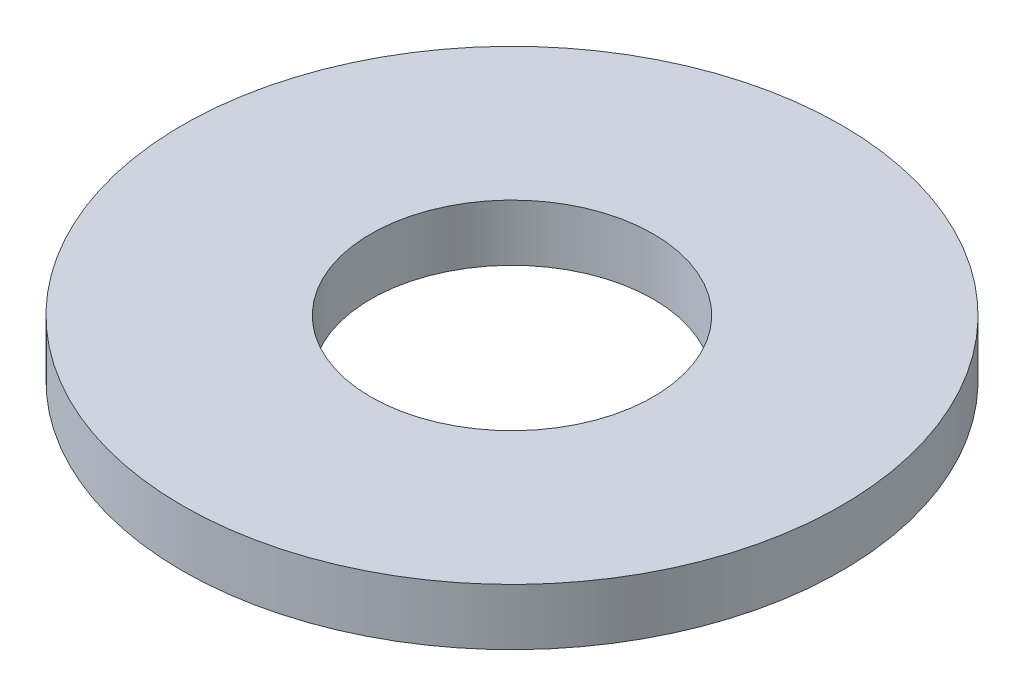
ISO-10303-21;
HEADER;
FILE_DESCRIPTION(('STEP AP214'),'2;1');
FILE_NAME('part.step','',(''),(''),'','','');
FILE_SCHEMA(('AUTOMOTIVE_DESIGN { 1 0 10303 214 1 1 1 1 }'));
ENDSEC;
DATA;
#1=APPLICATION_CONTEXT('core data for automotive mechanical design processes');
#2=APPLICATION_PROTOCOL_DEFINITION('international standard','automotive_design',2000,#1);
#3=PRODUCT_CONTEXT('',#1,'mechanical');
#4=PRODUCT('Part','Part','',(#3));
#5=PRODUCT_RELATED_PRODUCT_CATEGORY('part','',(#4));
#6=PRODUCT_DEFINITION_FORMATION('','',#4);
#7=PRODUCT_DEFINITION_CONTEXT('part definition',#1,'design');
#8=PRODUCT_DEFINITION('design','',#6,#7);
#9=PRODUCT_DEFINITION_SHAPE('','',#8);
#10=(LENGTH_UNIT() NAMED_UNIT(*) SI_UNIT(.MILLI.,.METRE.));
#11=(NAMED_UNIT(*) PLANE_ANGLE_UNIT() SI_UNIT($,.RADIAN.));
#12=(NAMED_UNIT(*) SI_UNIT($,.STERADIAN.) SOLID_ANGLE_UNIT());
#13=UNCERTAINTY_MEASURE_WITH_UNIT(LENGTH_MEASURE(1.E-05),#10,'distance_accuracy_value','');
#14=(GEOMETRIC_REPRESENTATION_CONTEXT(3) GLOBAL_UNCERTAINTY_ASSIGNED_CONTEXT((#13)) GLOBAL_UNIT_ASSIGNED_CONTEXT((#10,
#11,#12)) REPRESENTATION_CONTEXT('',''));
#15=CARTESIAN_POINT('',(0.,0.,0.));
#16=DIRECTION('',(0.,0.,1.));
#17=DIRECTION('',(1.,0.,0.));
#18=AXIS2_PLACEMENT_3D('',#15,#16,#17);
#19=CARTESIAN_POINT('',(0.,0.,0.));
#20=DIRECTION('',(0.,-1.,0.));
#21=DIRECTION('',(0.,0.,-1.));
#22=AXIS2_PLACEMENT_3D('',#19,#20,#21);
#23=CYLINDRICAL_SURFACE('',#22,1.5);
#24=CARTESIAN_POINT('',(0.,0.,0.));
#25=DIRECTION('',(0.,-1.,0.));
#26=DIRECTION('',(0.,0.,-1.));
#27=AXIS2_PLACEMENT_3D('',#24,#25,#26);
#28=CIRCLE('',#27,1.5);
#29=CARTESIAN_POINT('',(0.,0.,-1.5));
#30=VERTEX_POINT('',#29);
#31=EDGE_CURVE('E10',#30,#30,#28,.T.);
#32=ORIENTED_EDGE('',*,*,#31,.T.);
#33=EDGE_LOOP('',(#32));
#34=FACE_BOUND('',#33,.T.);
#35=CARTESIAN_POINT('',(0.,0.6,0.));
#36=DIRECTION('',(0.,-1.,0.));
#37=DIRECTION('',(0.,0.,-1.));
#38=AXIS2_PLACEMENT_3D('',#35,#36,#37);
#39=CIRCLE('',#38,1.5);
#40=CARTESIAN_POINT('',(0.,0.6,-1.5));
#41=VERTEX_POINT('',#40);
#42=EDGE_CURVE('E38',#41,#41,#39,.T.);
#43=ORIENTED_EDGE('',*,*,#42,.F.);
#44=EDGE_LOOP('',(#43));
#45=FACE_BOUND('',#44,.T.);
#46=ADVANCED_FACE('F14',(#34,#45),#23,.F.);
#47=CARTESIAN_POINT('',(1.5,0.,0.));
#48=DIRECTION('',(0.,-1.,0.));
#49=DIRECTION('',(0.,0.,-1.));
#50=AXIS2_PLACEMENT_3D('',#47,#48,#49);
#51=PLANE('',#50);
#52=CARTESIAN_POINT('',(0.,0.,0.));
#53=DIRECTION('',(0.,-1.,0.));
#54=DIRECTION('',(0.,0.,-1.));
#55=AXIS2_PLACEMENT_3D('',#52,#53,#54);
#56=CIRCLE('',#55,3.5);
#57=CARTESIAN_POINT('',(0.,0.,-3.5));
#58=VERTEX_POINT('',#57);
#59=EDGE_CURVE('E21',#58,#58,#56,.T.);
#60=ORIENTED_EDGE('',*,*,#59,.T.);
#61=EDGE_LOOP('',(#60));
#62=FACE_BOUND('',#61,.T.);
#63=ORIENTED_EDGE('',*,*,#31,.F.);
#64=EDGE_LOOP('',(#63));
#65=FACE_BOUND('',#64,.T.);
#66=ADVANCED_FACE('F49',(#62,#65),#51,.T.);
#67=CARTESIAN_POINT('',(0.,0.,0.));
#68=DIRECTION('',(0.,-1.,0.));
#69=DIRECTION('',(0.,0.,-1.));
#70=AXIS2_PLACEMENT_3D('',#67,#68,#69);
#71=CYLINDRICAL_SURFACE('',#70,3.5);
#72=CARTESIAN_POINT('',(0.,0.6,0.));
#73=DIRECTION('',(0.,-1.,0.));
#74=DIRECTION('',(0.,0.,-1.));
#75=AXIS2_PLACEMENT_3D('',#72,#73,#74);
#76=CIRCLE('',#75,3.5);
#77=CARTESIAN_POINT('',(0.,0.6,-3.5));
#78=VERTEX_POINT('',#77);
#79=EDGE_CURVE('E30',#78,#78,#76,.T.);
#80=ORIENTED_EDGE('',*,*,#79,.T.);
#81=EDGE_LOOP('',(#80));
#82=FACE_BOUND('',#81,.T.);
#83=ORIENTED_EDGE('',*,*,#59,.F.);
#84=EDGE_LOOP('',(#83));
#85=FACE_BOUND('',#84,.T.);
#86=ADVANCED_FACE('F54',(#82,#85),#71,.T.);
#87=CARTESIAN_POINT('',(3.5,0.6,0.));
#88=DIRECTION('',(0.,1.,0.));
#89=DIRECTION('',(0.,0.,1.));
#90=AXIS2_PLACEMENT_3D('',#87,#88,#89);
#91=PLANE('',#90);
#92=ORIENTED_EDGE('',*,*,#42,.T.);
#93=EDGE_LOOP('',(#92));
#94=FACE_BOUND('',#93,.T.);
#95=ORIENTED_EDGE('',*,*,#79,.F.);
#96=EDGE_LOOP('',(#95));
#97=FACE_BOUND('',#96,.T.);
#98=ADVANCED_FACE('F45',(#94,#97),#91,.T.);
#99=CLOSED_SHELL('',(#46,#66,#86,#98));
#100=MANIFOLD_SOLID_BREP('B1',#99);
#101=ADVANCED_BREP_SHAPE_REPRESENTATION('',(#18,#100),#14);
#102=SHAPE_DEFINITION_REPRESENTATION(#9,#101);
ENDSEC;
END-ISO-10303-21;
